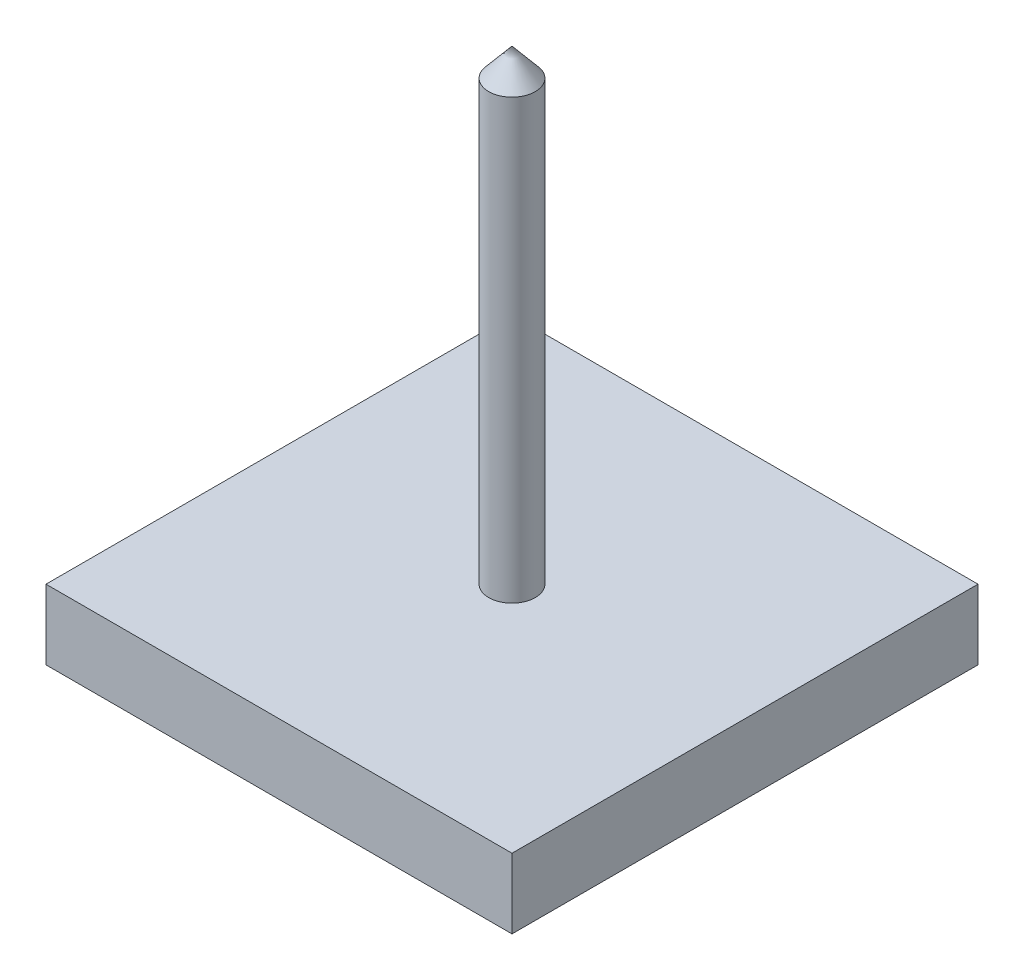
ISO-10303-21;
HEADER;
FILE_DESCRIPTION(('STEP AP214'),'2;1');
FILE_NAME('part.step','',(''),(''),'','','');
FILE_SCHEMA(('AUTOMOTIVE_DESIGN { 1 0 10303 214 1 1 1 1 }'));
ENDSEC;
DATA;
#1=APPLICATION_CONTEXT('core data for automotive mechanical design processes');
#2=APPLICATION_PROTOCOL_DEFINITION('international standard','automotive_design',2000,#1);
#3=PRODUCT_CONTEXT('',#1,'mechanical');
#4=PRODUCT('Part','Part','',(#3));
#5=PRODUCT_RELATED_PRODUCT_CATEGORY('part','',(#4));
#6=PRODUCT_DEFINITION_FORMATION('','',#4);
#7=PRODUCT_DEFINITION_CONTEXT('part definition',#1,'design');
#8=PRODUCT_DEFINITION('design','',#6,#7);
#9=PRODUCT_DEFINITION_SHAPE('','',#8);
#10=(LENGTH_UNIT() NAMED_UNIT(*) SI_UNIT(.MILLI.,.METRE.));
#11=(NAMED_UNIT(*) PLANE_ANGLE_UNIT() SI_UNIT($,.RADIAN.));
#12=(NAMED_UNIT(*) SI_UNIT($,.STERADIAN.) SOLID_ANGLE_UNIT());
#13=UNCERTAINTY_MEASURE_WITH_UNIT(LENGTH_MEASURE(1.E-05),#10,'distance_accuracy_value','');
#14=(GEOMETRIC_REPRESENTATION_CONTEXT(3) GLOBAL_UNCERTAINTY_ASSIGNED_CONTEXT((#13)) GLOBAL_UNIT_ASSIGNED_CONTEXT((#10,
#11,#12)) REPRESENTATION_CONTEXT('',''));
#15=CARTESIAN_POINT('',(0.,0.,0.));
#16=DIRECTION('',(0.,0.,1.));
#17=DIRECTION('',(1.,0.,0.));
#18=AXIS2_PLACEMENT_3D('',#15,#16,#17);
#19=CARTESIAN_POINT('',(0.,3.,0.));
#20=DIRECTION('',(1.,0.,0.));
#21=DIRECTION('',(0.,0.,-1.));
#22=AXIS2_PLACEMENT_3D('',#19,#20,#21);
#23=PLANE('',#22);
#24=DIRECTION('',(0.,0.,1.));
#25=VECTOR('',#24,1.);
#26=CARTESIAN_POINT('',(0.,0.,0.));
#27=LINE('',#26,#25);
#28=CARTESIAN_POINT('',(0.,0.,-20.));
#29=VERTEX_POINT('',#28);
#30=CARTESIAN_POINT('',(0.,0.,0.));
#31=VERTEX_POINT('',#30);
#32=EDGE_CURVE('E95',#29,#31,#27,.T.);
#33=ORIENTED_EDGE('',*,*,#32,.T.);
#34=DIRECTION('',(0.,-1.,0.));
#35=VECTOR('',#34,1.);
#36=CARTESIAN_POINT('',(0.,3.,0.));
#37=LINE('',#36,#35);
#38=CARTESIAN_POINT('',(0.,3.,0.));
#39=VERTEX_POINT('',#38);
#40=EDGE_CURVE('E11',#39,#31,#37,.T.);
#41=ORIENTED_EDGE('',*,*,#40,.F.);
#42=DIRECTION('',(0.,0.,1.));
#43=VECTOR('',#42,1.);
#44=CARTESIAN_POINT('',(0.,3.,0.));
#45=LINE('',#44,#43);
#46=CARTESIAN_POINT('',(0.,3.,-20.));
#47=VERTEX_POINT('',#46);
#48=EDGE_CURVE('E104',#47,#39,#45,.T.);
#49=ORIENTED_EDGE('',*,*,#48,.F.);
#50=DIRECTION('',(0.,-1.,0.));
#51=VECTOR('',#50,1.);
#52=CARTESIAN_POINT('',(0.,3.,-20.));
#53=LINE('',#52,#51);
#54=EDGE_CURVE('E109',#47,#29,#53,.T.);
#55=ORIENTED_EDGE('',*,*,#54,.T.);
#56=EDGE_LOOP('',(#33,#41,#49,#55));
#57=FACE_BOUND('',#56,.T.);
#58=ADVANCED_FACE('F34',(#57),#23,.F.);
#59=CARTESIAN_POINT('',(0.,3.,0.));
#60=DIRECTION('',(0.,0.,-1.));
#61=DIRECTION('',(-1.,0.,0.));
#62=AXIS2_PLACEMENT_3D('',#59,#60,#61);
#63=PLANE('',#62);
#64=DIRECTION('',(1.,0.,0.));
#65=VECTOR('',#64,1.);
#66=CARTESIAN_POINT('',(0.,0.,0.));
#67=LINE('',#66,#65);
#68=CARTESIAN_POINT('',(20.,0.,0.));
#69=VERTEX_POINT('',#68);
#70=EDGE_CURVE('E99',#31,#69,#67,.T.);
#71=ORIENTED_EDGE('',*,*,#70,.T.);
#72=DIRECTION('',(0.,-1.,0.));
#73=VECTOR('',#72,1.);
#74=CARTESIAN_POINT('',(20.,3.,0.));
#75=LINE('',#74,#73);
#76=CARTESIAN_POINT('',(20.,3.,0.));
#77=VERTEX_POINT('',#76);
#78=EDGE_CURVE('E42',#77,#69,#75,.T.);
#79=ORIENTED_EDGE('',*,*,#78,.F.);
#80=DIRECTION('',(1.,0.,0.));
#81=VECTOR('',#80,1.);
#82=CARTESIAN_POINT('',(0.,3.,0.));
#83=LINE('',#82,#81);
#84=EDGE_CURVE('E81',#39,#77,#83,.T.);
#85=ORIENTED_EDGE('',*,*,#84,.F.);
#86=ORIENTED_EDGE('',*,*,#40,.T.);
#87=EDGE_LOOP('',(#71,#79,#85,#86));
#88=FACE_BOUND('',#87,.T.);
#89=ADVANCED_FACE('F133',(#88),#63,.F.);
#90=CARTESIAN_POINT('',(20.,3.,0.));
#91=DIRECTION('',(-1.,0.,0.));
#92=DIRECTION('',(0.,0.,1.));
#93=AXIS2_PLACEMENT_3D('',#90,#91,#92);
#94=PLANE('',#93);
#95=DIRECTION('',(0.,0.,-1.));
#96=VECTOR('',#95,1.);
#97=CARTESIAN_POINT('',(20.,0.,0.));
#98=LINE('',#97,#96);
#99=CARTESIAN_POINT('',(20.,0.,-20.));
#100=VERTEX_POINT('',#99);
#101=EDGE_CURVE('E68',#69,#100,#98,.T.);
#102=ORIENTED_EDGE('',*,*,#101,.T.);
#103=DIRECTION('',(0.,-1.,0.));
#104=VECTOR('',#103,1.);
#105=CARTESIAN_POINT('',(20.,3.,-20.));
#106=LINE('',#105,#104);
#107=CARTESIAN_POINT('',(20.,3.,-20.));
#108=VERTEX_POINT('',#107);
#109=EDGE_CURVE('E115',#108,#100,#106,.T.);
#110=ORIENTED_EDGE('',*,*,#109,.F.);
#111=DIRECTION('',(0.,0.,-1.));
#112=VECTOR('',#111,1.);
#113=CARTESIAN_POINT('',(20.,3.,0.));
#114=LINE('',#113,#112);
#115=EDGE_CURVE('E107',#77,#108,#114,.T.);
#116=ORIENTED_EDGE('',*,*,#115,.F.);
#117=ORIENTED_EDGE('',*,*,#78,.T.);
#118=EDGE_LOOP('',(#102,#110,#116,#117));
#119=FACE_BOUND('',#118,.T.);
#120=ADVANCED_FACE('F117',(#119),#94,.F.);
#121=CARTESIAN_POINT('',(0.,3.,-20.));
#122=DIRECTION('',(0.,0.,1.));
#123=DIRECTION('',(1.,0.,0.));
#124=AXIS2_PLACEMENT_3D('',#121,#122,#123);
#125=PLANE('',#124);
#126=DIRECTION('',(-1.,0.,0.));
#127=VECTOR('',#126,1.);
#128=CARTESIAN_POINT('',(0.,0.,-20.));
#129=LINE('',#128,#127);
#130=EDGE_CURVE('E74',#100,#29,#129,.T.);
#131=ORIENTED_EDGE('',*,*,#130,.T.);
#132=ORIENTED_EDGE('',*,*,#54,.F.);
#133=DIRECTION('',(-1.,0.,0.));
#134=VECTOR('',#133,1.);
#135=CARTESIAN_POINT('',(0.,3.,-20.));
#136=LINE('',#135,#134);
#137=EDGE_CURVE('E50',#108,#47,#136,.T.);
#138=ORIENTED_EDGE('',*,*,#137,.F.);
#139=ORIENTED_EDGE('',*,*,#109,.T.);
#140=EDGE_LOOP('',(#131,#132,#138,#139));
#141=FACE_BOUND('',#140,.T.);
#142=ADVANCED_FACE('F123',(#141),#125,.F.);
#143=CARTESIAN_POINT('',(0.,3.,0.));
#144=DIRECTION('',(0.,-1.,0.));
#145=DIRECTION('',(0.,0.,-1.));
#146=AXIS2_PLACEMENT_3D('',#143,#144,#145);
#147=PLANE('',#146);
#148=CARTESIAN_POINT('',(10.,3.,-10.));
#149=DIRECTION('',(0.,-1.,0.));
#150=DIRECTION('',(0.,0.,-1.));
#151=AXIS2_PLACEMENT_3D('',#148,#149,#150);
#152=CIRCLE('',#151,1.);
#153=CARTESIAN_POINT('',(10.,3.,-11.));
#154=VERTEX_POINT('',#153);
#155=EDGE_CURVE('E96',#154,#154,#152,.T.);
#156=ORIENTED_EDGE('',*,*,#155,.T.);
#157=EDGE_LOOP('',(#156));
#158=FACE_BOUND('',#157,.T.);
#159=ORIENTED_EDGE('',*,*,#48,.T.);
#160=ORIENTED_EDGE('',*,*,#84,.T.);
#161=ORIENTED_EDGE('',*,*,#115,.T.);
#162=ORIENTED_EDGE('',*,*,#137,.T.);
#163=EDGE_LOOP('',(#159,#160,#161,#162));
#164=FACE_BOUND('',#163,.T.);
#165=ADVANCED_FACE('F125',(#158,#164),#147,.F.);
#166=CARTESIAN_POINT('',(0.,0.,0.));
#167=DIRECTION('',(0.,-1.,0.));
#168=DIRECTION('',(0.,0.,-1.));
#169=AXIS2_PLACEMENT_3D('',#166,#167,#168);
#170=PLANE('',#169);
#171=ORIENTED_EDGE('',*,*,#32,.F.);
#172=ORIENTED_EDGE('',*,*,#130,.F.);
#173=ORIENTED_EDGE('',*,*,#101,.F.);
#174=ORIENTED_EDGE('',*,*,#70,.F.);
#175=EDGE_LOOP('',(#171,#172,#173,#174));
#176=FACE_BOUND('',#175,.T.);
#177=ADVANCED_FACE('F89',(#176),#170,.T.);
#178=CARTESIAN_POINT('',(10.,21.8082464074058,-10.));
#179=DIRECTION('',(0.,-1.,0.));
#180=DIRECTION('',(0.,0.,-1.));
#181=AXIS2_PLACEMENT_3D('',#178,#179,#180);
#182=CONICAL_SURFACE('',#181,0.999999999999999,0.698131700797727);
#183=CARTESIAN_POINT('',(10.,23.,-10.));
#184=VERTEX_POINT('',#183);
#185=VERTEX_LOOP('',#184);
#186=FACE_BOUND('',#185,.T.);
#187=CARTESIAN_POINT('',(10.,21.8082464074058,-10.));
#188=DIRECTION('',(0.,-1.,0.));
#189=DIRECTION('',(0.,0.,-1.));
#190=AXIS2_PLACEMENT_3D('',#187,#188,#189);
#191=CIRCLE('',#190,0.999999999999999);
#192=CARTESIAN_POINT('',(10.,21.8082464074058,-11.));
#193=VERTEX_POINT('',#192);
#194=EDGE_CURVE('E93',#193,#193,#191,.T.);
#195=ORIENTED_EDGE('',*,*,#194,.F.);
#196=EDGE_LOOP('',(#195));
#197=FACE_BOUND('',#196,.T.);
#198=ADVANCED_FACE('F85',(#186,#197),#182,.T.);
#199=CARTESIAN_POINT('',(10.,3.,-10.));
#200=DIRECTION('',(0.,-1.,0.));
#201=DIRECTION('',(0.,0.,-1.));
#202=AXIS2_PLACEMENT_3D('',#199,#200,#201);
#203=CYLINDRICAL_SURFACE('',#202,1.);
#204=ORIENTED_EDGE('',*,*,#194,.T.);
#205=EDGE_LOOP('',(#204));
#206=FACE_BOUND('',#205,.T.);
#207=ORIENTED_EDGE('',*,*,#155,.F.);
#208=EDGE_LOOP('',(#207));
#209=FACE_BOUND('',#208,.T.);
#210=ADVANCED_FACE('F88',(#206,#209),#203,.T.);
#211=CLOSED_SHELL('',(#58,#89,#120,#142,#165,#177,#198,#210));
#212=MANIFOLD_SOLID_BREP('B2',#211);
#213=ADVANCED_BREP_SHAPE_REPRESENTATION('',(#18,#212),#14);
#214=SHAPE_DEFINITION_REPRESENTATION(#9,#213);
ENDSEC;
END-ISO-10303-21;
